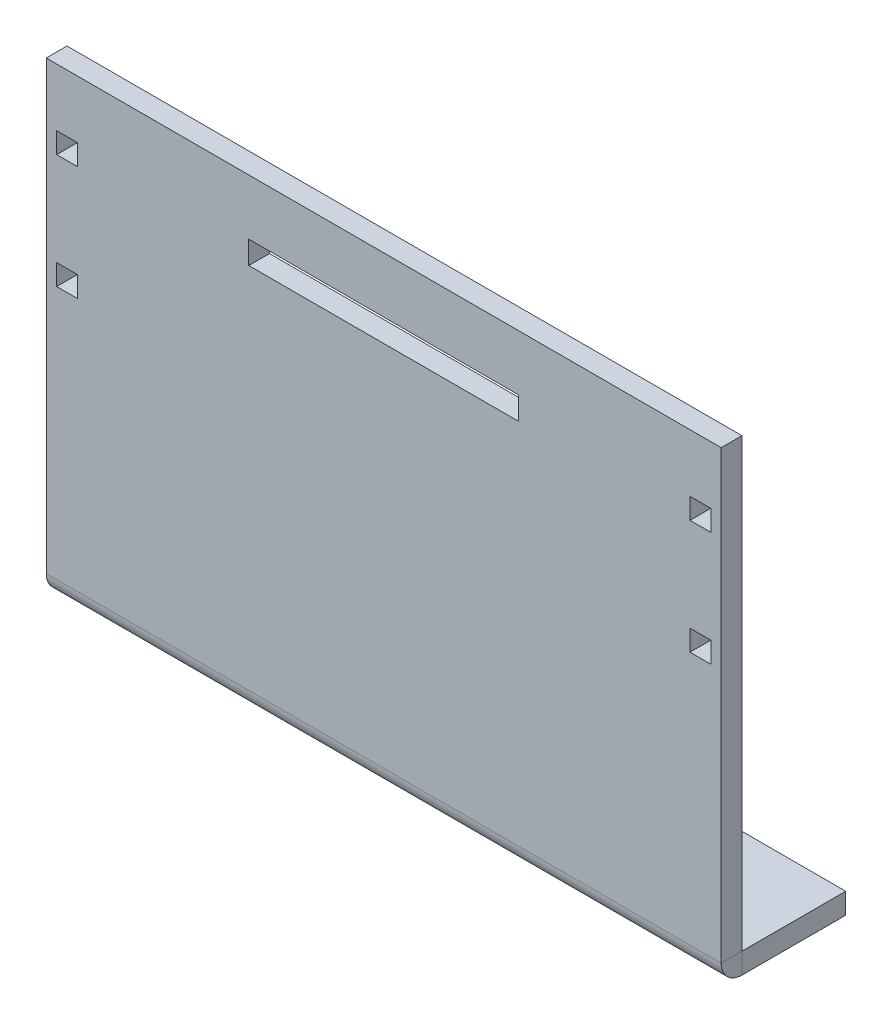
ISO-10303-21;
HEADER;
FILE_DESCRIPTION(('STEP AP214'),'2;1');
FILE_NAME('part.step','',(''),(''),'','','');
FILE_SCHEMA(('AUTOMOTIVE_DESIGN { 1 0 10303 214 1 1 1 1 }'));
ENDSEC;
DATA;
#1=APPLICATION_CONTEXT('core data for automotive mechanical design processes');
#2=APPLICATION_PROTOCOL_DEFINITION('international standard','automotive_design',2000,#1);
#3=PRODUCT_CONTEXT('',#1,'mechanical');
#4=PRODUCT('Part','Part','',(#3));
#5=PRODUCT_RELATED_PRODUCT_CATEGORY('part','',(#4));
#6=PRODUCT_DEFINITION_FORMATION('','',#4);
#7=PRODUCT_DEFINITION_CONTEXT('part definition',#1,'design');
#8=PRODUCT_DEFINITION('design','',#6,#7);
#9=PRODUCT_DEFINITION_SHAPE('','',#8);
#10=(LENGTH_UNIT() NAMED_UNIT(*) SI_UNIT(.MILLI.,.METRE.));
#11=(NAMED_UNIT(*) PLANE_ANGLE_UNIT() SI_UNIT($,.RADIAN.));
#12=(NAMED_UNIT(*) SI_UNIT($,.STERADIAN.) SOLID_ANGLE_UNIT());
#13=UNCERTAINTY_MEASURE_WITH_UNIT(LENGTH_MEASURE(1.E-05),#10,'distance_accuracy_value','');
#14=(GEOMETRIC_REPRESENTATION_CONTEXT(3) GLOBAL_UNCERTAINTY_ASSIGNED_CONTEXT((#13)) GLOBAL_UNIT_ASSIGNED_CONTEXT((#10,
#11,#12)) REPRESENTATION_CONTEXT('',''));
#15=CARTESIAN_POINT('',(0.,0.,0.));
#16=DIRECTION('',(0.,0.,1.));
#17=DIRECTION('',(1.,0.,0.));
#18=AXIS2_PLACEMENT_3D('',#15,#16,#17);
#19=CARTESIAN_POINT('',(0.,-26.4390270962824,0.));
#20=DIRECTION('',(0.,1.,0.));
#21=DIRECTION('',(0.,0.,1.));
#22=AXIS2_PLACEMENT_3D('',#19,#20,#21);
#23=PLANE('',#22);
#24=DIRECTION('',(0.,0.,-1.));
#25=VECTOR('',#24,1.);
#26=CARTESIAN_POINT('',(-32.4252873563218,-26.4390270962824,0.));
#27=LINE('',#26,#25);
#28=CARTESIAN_POINT('',(-32.4252873563218,-26.4390270962825,-1.99999999999999));
#29=VERTEX_POINT('',#28);
#30=CARTESIAN_POINT('',(-32.4252873563218,-26.4390270962825,-12.));
#31=VERTEX_POINT('',#30);
#32=EDGE_CURVE('E494',#29,#31,#27,.T.);
#33=ORIENTED_EDGE('',*,*,#32,.T.);
#34=DIRECTION('',(1.,0.,0.));
#35=VECTOR('',#34,1.);
#36=CARTESIAN_POINT('',(0.,-26.4390270962825,-12.));
#37=LINE('',#36,#35);
#38=CARTESIAN_POINT('',(32.5747126436782,-26.4390270962825,-12.));
#39=VERTEX_POINT('',#38);
#40=EDGE_CURVE('E491',#31,#39,#37,.T.);
#41=ORIENTED_EDGE('',*,*,#40,.T.);
#42=DIRECTION('',(0.,0.,1.));
#43=VECTOR('',#42,1.);
#44=CARTESIAN_POINT('',(32.5747126436782,-26.4390270962824,0.));
#45=LINE('',#44,#43);
#46=CARTESIAN_POINT('',(32.5747126436782,-26.4390270962825,-1.99999999999999));
#47=VERTEX_POINT('',#46);
#48=EDGE_CURVE('E487',#39,#47,#45,.T.);
#49=ORIENTED_EDGE('',*,*,#48,.T.);
#50=DIRECTION('',(-1.,0.,0.));
#51=VECTOR('',#50,1.);
#52=CARTESIAN_POINT('',(0.,-26.4390270962825,-1.99999999999999));
#53=LINE('',#52,#51);
#54=EDGE_CURVE('E483',#47,#29,#53,.T.);
#55=ORIENTED_EDGE('',*,*,#54,.T.);
#56=EDGE_LOOP('',(#33,#41,#49,#55));
#57=FACE_BOUND('',#56,.T.);
#58=CARTESIAN_POINT('',(23.0747126436782,-26.4390270962825,-7.));
#59=DIRECTION('',(0.,-1.,0.));
#60=DIRECTION('',(0.,0.,-1.));
#61=AXIS2_PLACEMENT_3D('',#58,#59,#60);
#62=CIRCLE('',#61,1.65);
#63=CARTESIAN_POINT('',(23.0747126436782,-26.4390270962825,-8.65));
#64=VERTEX_POINT('',#63);
#65=EDGE_CURVE('E707',#64,#64,#62,.T.);
#66=ORIENTED_EDGE('',*,*,#65,.F.);
#67=EDGE_LOOP('',(#66));
#68=FACE_BOUND('',#67,.T.);
#69=CARTESIAN_POINT('',(-22.9252873563218,-26.4390270962825,-7.));
#70=DIRECTION('',(0.,1.,0.));
#71=DIRECTION('',(0.,0.,1.));
#72=AXIS2_PLACEMENT_3D('',#69,#70,#71);
#73=CIRCLE('',#72,1.65);
#74=CARTESIAN_POINT('',(-22.9252873563218,-26.4390270962825,-5.35));
#75=VERTEX_POINT('',#74);
#76=EDGE_CURVE('E306',#75,#75,#73,.T.);
#77=ORIENTED_EDGE('',*,*,#76,.T.);
#78=EDGE_LOOP('',(#77));
#79=FACE_BOUND('',#78,.T.);
#80=ADVANCED_FACE('F67',(#57,#68,#79),#23,.F.);
#81=CARTESIAN_POINT('',(0.,-24.4390270962824,0.));
#82=DIRECTION('',(0.,1.,0.));
#83=DIRECTION('',(0.,0.,1.));
#84=AXIS2_PLACEMENT_3D('',#81,#82,#83);
#85=PLANE('',#84);
#86=CARTESIAN_POINT('',(23.0747126436782,-24.4390270962825,-7.));
#87=DIRECTION('',(0.,-1.,0.));
#88=DIRECTION('',(0.,0.,-1.));
#89=AXIS2_PLACEMENT_3D('',#86,#87,#88);
#90=CIRCLE('',#89,1.65);
#91=CARTESIAN_POINT('',(23.0747126436782,-24.4390270962825,-8.65));
#92=VERTEX_POINT('',#91);
#93=EDGE_CURVE('E701',#92,#92,#90,.T.);
#94=ORIENTED_EDGE('',*,*,#93,.T.);
#95=EDGE_LOOP('',(#94));
#96=FACE_BOUND('',#95,.T.);
#97=DIRECTION('',(0.,0.,1.));
#98=VECTOR('',#97,1.);
#99=CARTESIAN_POINT('',(-32.4252873563218,-24.4390270962825,-12.));
#100=LINE('',#99,#98);
#101=CARTESIAN_POINT('',(-32.4252873563218,-24.4390270962824,-2.));
#102=VERTEX_POINT('',#101);
#103=CARTESIAN_POINT('',(-32.4252873563218,-24.4390270962825,-12.));
#104=VERTEX_POINT('',#103);
#105=EDGE_CURVE('E456',#102,#104,#100,.F.);
#106=ORIENTED_EDGE('',*,*,#105,.F.);
#107=DIRECTION('',(1.,0.,0.));
#108=VECTOR('',#107,1.);
#109=CARTESIAN_POINT('',(-32.4252873563218,-24.4390270962824,-2.));
#110=LINE('',#109,#108);
#111=CARTESIAN_POINT('',(32.5747126436782,-24.4390270962825,-2.));
#112=VERTEX_POINT('',#111);
#113=EDGE_CURVE('E498',#112,#102,#110,.F.);
#114=ORIENTED_EDGE('',*,*,#113,.F.);
#115=DIRECTION('',(0.,0.,-1.));
#116=VECTOR('',#115,1.);
#117=CARTESIAN_POINT('',(32.5747126436782,-24.4390270962824,-2.));
#118=LINE('',#117,#116);
#119=CARTESIAN_POINT('',(32.5747126436782,-24.4390270962825,-12.));
#120=VERTEX_POINT('',#119);
#121=EDGE_CURVE('E502',#120,#112,#118,.F.);
#122=ORIENTED_EDGE('',*,*,#121,.F.);
#123=DIRECTION('',(-1.,0.,0.));
#124=VECTOR('',#123,1.);
#125=CARTESIAN_POINT('',(32.5747126436782,-24.4390270962825,-12.));
#126=LINE('',#125,#124);
#127=EDGE_CURVE('E506',#104,#120,#126,.F.);
#128=ORIENTED_EDGE('',*,*,#127,.F.);
#129=EDGE_LOOP('',(#106,#114,#122,#128));
#130=FACE_BOUND('',#129,.T.);
#131=CARTESIAN_POINT('',(-22.9252873563218,-24.4390270962825,-7.));
#132=DIRECTION('',(0.,1.,0.));
#133=DIRECTION('',(0.,0.,1.));
#134=AXIS2_PLACEMENT_3D('',#131,#132,#133);
#135=CIRCLE('',#134,1.65);
#136=CARTESIAN_POINT('',(-22.9252873563218,-24.4390270962825,-5.35000000000001));
#137=VERTEX_POINT('',#136);
#138=EDGE_CURVE('E699',#137,#137,#135,.T.);
#139=ORIENTED_EDGE('',*,*,#138,.F.);
#140=EDGE_LOOP('',(#139));
#141=FACE_BOUND('',#140,.T.);
#142=ADVANCED_FACE('F586',(#96,#130,#141),#85,.T.);
#143=CARTESIAN_POINT('',(0.,0.,-2.));
#144=DIRECTION('',(0.,0.,1.));
#145=DIRECTION('',(1.,0.,0.));
#146=AXIS2_PLACEMENT_3D('',#143,#144,#145);
#147=PLANE('',#146);
#148=DIRECTION('',(1.,0.,0.));
#149=VECTOR('',#148,1.);
#150=CARTESIAN_POINT('',(-12.9252873563218,13.2,-2.));
#151=LINE('',#150,#149);
#152=CARTESIAN_POINT('',(-12.9252873563218,13.2,-2.));
#153=VERTEX_POINT('',#152);
#154=CARTESIAN_POINT('',(13.0747126436782,13.2,-2.));
#155=VERTEX_POINT('',#154);
#156=EDGE_CURVE('E349',#153,#155,#151,.T.);
#157=ORIENTED_EDGE('',*,*,#156,.F.);
#158=DIRECTION('',(0.,-1.,0.));
#159=VECTOR('',#158,1.);
#160=CARTESIAN_POINT('',(-12.9252873563218,13.2,-2.));
#161=LINE('',#160,#159);
#162=CARTESIAN_POINT('',(-12.9252873563218,11.,-2.));
#163=VERTEX_POINT('',#162);
#164=EDGE_CURVE('E364',#153,#163,#161,.T.);
#165=ORIENTED_EDGE('',*,*,#164,.T.);
#166=DIRECTION('',(1.,0.,0.));
#167=VECTOR('',#166,1.);
#168=CARTESIAN_POINT('',(-12.9252873563218,11.,-2.));
#169=LINE('',#168,#167);
#170=CARTESIAN_POINT('',(13.0747126436782,11.,-2.));
#171=VERTEX_POINT('',#170);
#172=EDGE_CURVE('E380',#163,#171,#169,.T.);
#173=ORIENTED_EDGE('',*,*,#172,.T.);
#174=DIRECTION('',(0.,-1.,0.));
#175=VECTOR('',#174,1.);
#176=CARTESIAN_POINT('',(13.0747126436782,13.2,-2.));
#177=LINE('',#176,#175);
#178=EDGE_CURVE('E377',#155,#171,#177,.T.);
#179=ORIENTED_EDGE('',*,*,#178,.F.);
#180=EDGE_LOOP('',(#157,#165,#173,#179));
#181=FACE_BOUND('',#180,.T.);
#182=DIRECTION('',(0.,1.,0.));
#183=VECTOR('',#182,1.);
#184=CARTESIAN_POINT('',(29.5747126436783,0.,-2.));
#185=LINE('',#184,#183);
#186=CARTESIAN_POINT('',(29.5747126436783,0.,-2.));
#187=VERTEX_POINT('',#186);
#188=CARTESIAN_POINT('',(29.5747126436783,1.99999999999999,-2.));
#189=VERTEX_POINT('',#188);
#190=EDGE_CURVE('E322',#187,#189,#185,.T.);
#191=ORIENTED_EDGE('',*,*,#190,.F.);
#192=DIRECTION('',(1.,0.,0.));
#193=VECTOR('',#192,1.);
#194=CARTESIAN_POINT('',(29.5747126436783,0.,-2.));
#195=LINE('',#194,#193);
#196=CARTESIAN_POINT('',(31.5747126436783,0.,-2.));
#197=VERTEX_POINT('',#196);
#198=EDGE_CURVE('E316',#187,#197,#195,.T.);
#199=ORIENTED_EDGE('',*,*,#198,.T.);
#200=DIRECTION('',(0.,1.,0.));
#201=VECTOR('',#200,1.);
#202=CARTESIAN_POINT('',(31.5747126436783,0.,-2.));
#203=LINE('',#202,#201);
#204=CARTESIAN_POINT('',(31.5747126436783,1.99999999999999,-2.));
#205=VERTEX_POINT('',#204);
#206=EDGE_CURVE('E336',#197,#205,#203,.T.);
#207=ORIENTED_EDGE('',*,*,#206,.T.);
#208=DIRECTION('',(1.,0.,0.));
#209=VECTOR('',#208,1.);
#210=CARTESIAN_POINT('',(29.5747126436783,1.99999999999999,-2.));
#211=LINE('',#210,#209);
#212=EDGE_CURVE('E340',#189,#205,#211,.T.);
#213=ORIENTED_EDGE('',*,*,#212,.F.);
#214=EDGE_LOOP('',(#191,#199,#207,#213));
#215=FACE_BOUND('',#214,.T.);
#216=DIRECTION('',(-1.,0.,0.));
#217=VECTOR('',#216,1.);
#218=CARTESIAN_POINT('',(0.,0.,-2.));
#219=LINE('',#218,#217);
#220=CARTESIAN_POINT('',(-29.4252873563217,0.,-2.));
#221=VERTEX_POINT('',#220);
#222=CARTESIAN_POINT('',(-31.4252873563217,0.,-2.));
#223=VERTEX_POINT('',#222);
#224=EDGE_CURVE('E436',#221,#223,#219,.T.);
#225=ORIENTED_EDGE('',*,*,#224,.F.);
#226=DIRECTION('',(0.,1.,0.));
#227=VECTOR('',#226,1.);
#228=CARTESIAN_POINT('',(-29.4252873563217,0.,-2.));
#229=LINE('',#228,#227);
#230=CARTESIAN_POINT('',(-29.4252873563217,1.99999999999999,-2.));
#231=VERTEX_POINT('',#230);
#232=EDGE_CURVE('E423',#221,#231,#229,.T.);
#233=ORIENTED_EDGE('',*,*,#232,.T.);
#234=DIRECTION('',(-1.,0.,0.));
#235=VECTOR('',#234,1.);
#236=CARTESIAN_POINT('',(0.,1.99999999999999,-2.));
#237=LINE('',#236,#235);
#238=CARTESIAN_POINT('',(-31.4252873563217,1.99999999999999,-2.));
#239=VERTEX_POINT('',#238);
#240=EDGE_CURVE('E427',#231,#239,#237,.T.);
#241=ORIENTED_EDGE('',*,*,#240,.T.);
#242=DIRECTION('',(0.,1.,0.));
#243=VECTOR('',#242,1.);
#244=CARTESIAN_POINT('',(-31.4252873563217,0.,-2.));
#245=LINE('',#244,#243);
#246=EDGE_CURVE('E432',#223,#239,#245,.T.);
#247=ORIENTED_EDGE('',*,*,#246,.F.);
#248=EDGE_LOOP('',(#225,#233,#241,#247));
#249=FACE_BOUND('',#248,.T.);
#250=ORIENTED_EDGE('',*,*,#113,.T.);
#251=DIRECTION('',(0.,-1.,0.));
#252=VECTOR('',#251,1.);
#253=CARTESIAN_POINT('',(-32.4252873563218,18.5609729037175,-2.));
#254=LINE('',#253,#252);
#255=CARTESIAN_POINT('',(-32.4252873563218,18.5609729037175,-2.));
#256=VERTEX_POINT('',#255);
#257=EDGE_CURVE('E528',#256,#102,#254,.T.);
#258=ORIENTED_EDGE('',*,*,#257,.F.);
#259=DIRECTION('',(-1.,0.,0.));
#260=VECTOR('',#259,1.);
#261=CARTESIAN_POINT('',(-32.4252873563218,18.5609729037175,-2.));
#262=LINE('',#261,#260);
#263=CARTESIAN_POINT('',(32.5747126436782,18.5609729037175,-2.));
#264=VERTEX_POINT('',#263);
#265=EDGE_CURVE('E536',#264,#256,#262,.T.);
#266=ORIENTED_EDGE('',*,*,#265,.F.);
#267=DIRECTION('',(0.,1.,0.));
#268=VECTOR('',#267,1.);
#269=CARTESIAN_POINT('',(32.5747126436782,18.5609729037175,-2.));
#270=LINE('',#269,#268);
#271=EDGE_CURVE('E532',#112,#264,#270,.T.);
#272=ORIENTED_EDGE('',*,*,#271,.F.);
#273=EDGE_LOOP('',(#250,#258,#266,#272));
#274=FACE_BOUND('',#273,.T.);
#275=DIRECTION('',(-1.,0.,0.));
#276=VECTOR('',#275,1.);
#277=CARTESIAN_POINT('',(-29.4252873563218,11.,-2.));
#278=LINE('',#277,#276);
#279=CARTESIAN_POINT('',(-29.4252873563218,11.,-2.));
#280=VERTEX_POINT('',#279);
#281=CARTESIAN_POINT('',(-31.4252873563218,11.,-2.));
#282=VERTEX_POINT('',#281);
#283=EDGE_CURVE('E287',#280,#282,#278,.T.);
#284=ORIENTED_EDGE('',*,*,#283,.F.);
#285=DIRECTION('',(0.,1.,0.));
#286=VECTOR('',#285,1.);
#287=CARTESIAN_POINT('',(-29.4252873563218,11.,-2.));
#288=LINE('',#287,#286);
#289=CARTESIAN_POINT('',(-29.4252873563218,13.,-2.));
#290=VERTEX_POINT('',#289);
#291=EDGE_CURVE('E254',#280,#290,#288,.T.);
#292=ORIENTED_EDGE('',*,*,#291,.T.);
#293=DIRECTION('',(-1.,0.,0.));
#294=VECTOR('',#293,1.);
#295=CARTESIAN_POINT('',(-29.4252873563218,13.,-2.));
#296=LINE('',#295,#294);
#297=CARTESIAN_POINT('',(-31.4252873563218,13.,-2.));
#298=VERTEX_POINT('',#297);
#299=EDGE_CURVE('E295',#290,#298,#296,.T.);
#300=ORIENTED_EDGE('',*,*,#299,.T.);
#301=DIRECTION('',(0.,1.,0.));
#302=VECTOR('',#301,1.);
#303=CARTESIAN_POINT('',(-31.4252873563218,11.,-2.));
#304=LINE('',#303,#302);
#305=EDGE_CURVE('E290',#282,#298,#304,.T.);
#306=ORIENTED_EDGE('',*,*,#305,.F.);
#307=EDGE_LOOP('',(#284,#292,#300,#306));
#308=FACE_BOUND('',#307,.T.);
#309=DIRECTION('',(0.,1.,0.));
#310=VECTOR('',#309,1.);
#311=CARTESIAN_POINT('',(29.5747126436782,11.,-2.));
#312=LINE('',#311,#310);
#313=CARTESIAN_POINT('',(29.5747126436782,11.,-2.));
#314=VERTEX_POINT('',#313);
#315=CARTESIAN_POINT('',(29.5747126436782,13.,-2.));
#316=VERTEX_POINT('',#315);
#317=EDGE_CURVE('E402',#314,#316,#312,.T.);
#318=ORIENTED_EDGE('',*,*,#317,.F.);
#319=DIRECTION('',(1.,0.,0.));
#320=VECTOR('',#319,1.);
#321=CARTESIAN_POINT('',(29.5747126436782,11.,-2.));
#322=LINE('',#321,#320);
#323=CARTESIAN_POINT('',(31.5747126436782,11.,-2.));
#324=VERTEX_POINT('',#323);
#325=EDGE_CURVE('E396',#314,#324,#322,.T.);
#326=ORIENTED_EDGE('',*,*,#325,.T.);
#327=DIRECTION('',(0.,1.,0.));
#328=VECTOR('',#327,1.);
#329=CARTESIAN_POINT('',(31.5747126436782,11.,-2.));
#330=LINE('',#329,#328);
#331=CARTESIAN_POINT('',(31.5747126436782,13.,-2.));
#332=VERTEX_POINT('',#331);
#333=EDGE_CURVE('E91',#324,#332,#330,.T.);
#334=ORIENTED_EDGE('',*,*,#333,.T.);
#335=DIRECTION('',(1.,0.,0.));
#336=VECTOR('',#335,1.);
#337=CARTESIAN_POINT('',(29.5747126436782,13.,-2.));
#338=LINE('',#337,#336);
#339=EDGE_CURVE('E418',#316,#332,#338,.T.);
#340=ORIENTED_EDGE('',*,*,#339,.F.);
#341=EDGE_LOOP('',(#318,#326,#334,#340));
#342=FACE_BOUND('',#341,.T.);
#343=ADVANCED_FACE('F576',(#181,#215,#249,#274,#308,#342),#147,.F.);
#344=CARTESIAN_POINT('',(0.,0.,0.));
#345=DIRECTION('',(0.,0.,1.));
#346=DIRECTION('',(1.,0.,0.));
#347=AXIS2_PLACEMENT_3D('',#344,#345,#346);
#348=PLANE('',#347);
#349=DIRECTION('',(0.,-1.,0.));
#350=VECTOR('',#349,1.);
#351=CARTESIAN_POINT('',(-12.9252873563218,13.2,0.));
#352=LINE('',#351,#350);
#353=CARTESIAN_POINT('',(-12.9252873563218,13.2,0.));
#354=VERTEX_POINT('',#353);
#355=CARTESIAN_POINT('',(-12.9252873563218,11.,0.));
#356=VERTEX_POINT('',#355);
#357=EDGE_CURVE('E371',#354,#356,#352,.T.);
#358=ORIENTED_EDGE('',*,*,#357,.F.);
#359=DIRECTION('',(1.,0.,0.));
#360=VECTOR('',#359,1.);
#361=CARTESIAN_POINT('',(-12.9252873563218,13.2,0.));
#362=LINE('',#361,#360);
#363=CARTESIAN_POINT('',(13.0747126436782,13.2,0.));
#364=VERTEX_POINT('',#363);
#365=EDGE_CURVE('E359',#354,#364,#362,.T.);
#366=ORIENTED_EDGE('',*,*,#365,.T.);
#367=DIRECTION('',(0.,-1.,0.));
#368=VECTOR('',#367,1.);
#369=CARTESIAN_POINT('',(13.0747126436782,13.2,0.));
#370=LINE('',#369,#368);
#371=CARTESIAN_POINT('',(13.0747126436782,11.,0.));
#372=VERTEX_POINT('',#371);
#373=EDGE_CURVE('E363',#364,#372,#370,.T.);
#374=ORIENTED_EDGE('',*,*,#373,.T.);
#375=DIRECTION('',(1.,0.,0.));
#376=VECTOR('',#375,1.);
#377=CARTESIAN_POINT('',(-12.9252873563218,11.,0.));
#378=LINE('',#377,#376);
#379=EDGE_CURVE('E368',#356,#372,#378,.T.);
#380=ORIENTED_EDGE('',*,*,#379,.F.);
#381=EDGE_LOOP('',(#358,#366,#374,#380));
#382=FACE_BOUND('',#381,.T.);
#383=DIRECTION('',(0.,1.,0.));
#384=VECTOR('',#383,1.);
#385=CARTESIAN_POINT('',(-29.4252873563218,11.,0.));
#386=LINE('',#385,#384);
#387=CARTESIAN_POINT('',(-29.4252873563218,11.,0.));
#388=VERTEX_POINT('',#387);
#389=CARTESIAN_POINT('',(-29.4252873563218,13.,0.));
#390=VERTEX_POINT('',#389);
#391=EDGE_CURVE('E251',#388,#390,#386,.T.);
#392=ORIENTED_EDGE('',*,*,#391,.F.);
#393=DIRECTION('',(-1.,0.,0.));
#394=VECTOR('',#393,1.);
#395=CARTESIAN_POINT('',(-29.4252873563218,11.,0.));
#396=LINE('',#395,#394);
#397=CARTESIAN_POINT('',(-31.4252873563218,11.,0.));
#398=VERTEX_POINT('',#397);
#399=EDGE_CURVE('E262',#388,#398,#396,.T.);
#400=ORIENTED_EDGE('',*,*,#399,.T.);
#401=DIRECTION('',(0.,1.,0.));
#402=VECTOR('',#401,1.);
#403=CARTESIAN_POINT('',(-31.4252873563218,11.,0.));
#404=LINE('',#403,#402);
#405=CARTESIAN_POINT('',(-31.4252873563218,13.,0.));
#406=VERTEX_POINT('',#405);
#407=EDGE_CURVE('E269',#398,#406,#404,.T.);
#408=ORIENTED_EDGE('',*,*,#407,.T.);
#409=DIRECTION('',(-1.,0.,0.));
#410=VECTOR('',#409,1.);
#411=CARTESIAN_POINT('',(-29.4252873563218,13.,0.));
#412=LINE('',#411,#410);
#413=EDGE_CURVE('E275',#390,#406,#412,.T.);
#414=ORIENTED_EDGE('',*,*,#413,.F.);
#415=EDGE_LOOP('',(#392,#400,#408,#414));
#416=FACE_BOUND('',#415,.T.);
#417=DIRECTION('',(0.,1.,0.));
#418=VECTOR('',#417,1.);
#419=CARTESIAN_POINT('',(-29.4252873563217,0.,0.));
#420=LINE('',#419,#418);
#421=CARTESIAN_POINT('',(-29.4252873563217,0.,0.));
#422=VERTEX_POINT('',#421);
#423=CARTESIAN_POINT('',(-29.4252873563217,1.99999999999999,0.));
#424=VERTEX_POINT('',#423);
#425=EDGE_CURVE('E374',#422,#424,#420,.T.);
#426=ORIENTED_EDGE('',*,*,#425,.F.);
#427=DIRECTION('',(-1.,0.,0.));
#428=VECTOR('',#427,1.);
#429=CARTESIAN_POINT('',(0.,0.,0.));
#430=LINE('',#429,#428);
#431=CARTESIAN_POINT('',(-31.4252873563217,0.,0.));
#432=VERTEX_POINT('',#431);
#433=EDGE_CURVE('E428',#422,#432,#430,.T.);
#434=ORIENTED_EDGE('',*,*,#433,.T.);
#435=DIRECTION('',(0.,1.,0.));
#436=VECTOR('',#435,1.);
#437=CARTESIAN_POINT('',(-31.4252873563217,0.,0.));
#438=LINE('',#437,#436);
#439=CARTESIAN_POINT('',(-31.4252873563217,1.99999999999999,0.));
#440=VERTEX_POINT('',#439);
#441=EDGE_CURVE('E446',#432,#440,#438,.T.);
#442=ORIENTED_EDGE('',*,*,#441,.T.);
#443=DIRECTION('',(-1.,0.,0.));
#444=VECTOR('',#443,1.);
#445=CARTESIAN_POINT('',(0.,1.99999999999999,0.));
#446=LINE('',#445,#444);
#447=EDGE_CURVE('E442',#424,#440,#446,.T.);
#448=ORIENTED_EDGE('',*,*,#447,.F.);
#449=EDGE_LOOP('',(#426,#434,#442,#448));
#450=FACE_BOUND('',#449,.T.);
#451=DIRECTION('',(0.,-1.,0.));
#452=VECTOR('',#451,1.);
#453=CARTESIAN_POINT('',(-32.4252873563218,18.5609729037175,0.));
#454=LINE('',#453,#452);
#455=CARTESIAN_POINT('',(-32.4252873563218,18.5609729037175,0.));
#456=VERTEX_POINT('',#455);
#457=CARTESIAN_POINT('',(-32.4252873563218,-24.4390270962825,0.));
#458=VERTEX_POINT('',#457);
#459=EDGE_CURVE('E527',#456,#458,#454,.T.);
#460=ORIENTED_EDGE('',*,*,#459,.T.);
#461=DIRECTION('',(-1.,0.,0.));
#462=VECTOR('',#461,1.);
#463=CARTESIAN_POINT('',(0.,-24.4390270962824,0.));
#464=LINE('',#463,#462);
#465=CARTESIAN_POINT('',(32.5747126436782,-24.4390270962824,0.));
#466=VERTEX_POINT('',#465);
#467=EDGE_CURVE('E514',#466,#458,#464,.T.);
#468=ORIENTED_EDGE('',*,*,#467,.F.);
#469=DIRECTION('',(0.,1.,0.));
#470=VECTOR('',#469,1.);
#471=CARTESIAN_POINT('',(32.5747126436782,18.5609729037175,0.));
#472=LINE('',#471,#470);
#473=CARTESIAN_POINT('',(32.5747126436782,18.5609729037175,0.));
#474=VERTEX_POINT('',#473);
#475=EDGE_CURVE('E543',#466,#474,#472,.T.);
#476=ORIENTED_EDGE('',*,*,#475,.T.);
#477=DIRECTION('',(-1.,0.,0.));
#478=VECTOR('',#477,1.);
#479=CARTESIAN_POINT('',(-32.4252873563218,18.5609729037175,0.));
#480=LINE('',#479,#478);
#481=EDGE_CURVE('E533',#474,#456,#480,.T.);
#482=ORIENTED_EDGE('',*,*,#481,.T.);
#483=EDGE_LOOP('',(#460,#468,#476,#482));
#484=FACE_BOUND('',#483,.T.);
#485=DIRECTION('',(1.,0.,0.));
#486=VECTOR('',#485,1.);
#487=CARTESIAN_POINT('',(29.5747126436783,0.,0.));
#488=LINE('',#487,#486);
#489=CARTESIAN_POINT('',(29.5747126436783,0.,0.));
#490=VERTEX_POINT('',#489);
#491=CARTESIAN_POINT('',(31.5747126436783,0.,0.));
#492=VERTEX_POINT('',#491);
#493=EDGE_CURVE('E317',#490,#492,#488,.T.);
#494=ORIENTED_EDGE('',*,*,#493,.F.);
#495=DIRECTION('',(0.,1.,0.));
#496=VECTOR('',#495,1.);
#497=CARTESIAN_POINT('',(29.5747126436783,0.,0.));
#498=LINE('',#497,#496);
#499=CARTESIAN_POINT('',(29.5747126436783,1.99999999999999,0.));
#500=VERTEX_POINT('',#499);
#501=EDGE_CURVE('E259',#490,#500,#498,.T.);
#502=ORIENTED_EDGE('',*,*,#501,.T.);
#503=DIRECTION('',(1.,0.,0.));
#504=VECTOR('',#503,1.);
#505=CARTESIAN_POINT('',(29.5747126436783,1.99999999999999,0.));
#506=LINE('',#505,#504);
#507=CARTESIAN_POINT('',(31.5747126436783,1.99999999999999,0.));
#508=VERTEX_POINT('',#507);
#509=EDGE_CURVE('E326',#500,#508,#506,.T.);
#510=ORIENTED_EDGE('',*,*,#509,.T.);
#511=DIRECTION('',(0.,1.,0.));
#512=VECTOR('',#511,1.);
#513=CARTESIAN_POINT('',(31.5747126436783,0.,0.));
#514=LINE('',#513,#512);
#515=EDGE_CURVE('E321',#492,#508,#514,.T.);
#516=ORIENTED_EDGE('',*,*,#515,.F.);
#517=EDGE_LOOP('',(#494,#502,#510,#516));
#518=FACE_BOUND('',#517,.T.);
#519=DIRECTION('',(1.,0.,0.));
#520=VECTOR('',#519,1.);
#521=CARTESIAN_POINT('',(29.5747126436782,11.,0.));
#522=LINE('',#521,#520);
#523=CARTESIAN_POINT('',(29.5747126436782,11.,0.));
#524=VERTEX_POINT('',#523);
#525=CARTESIAN_POINT('',(31.5747126436782,11.,0.));
#526=VERTEX_POINT('',#525);
#527=EDGE_CURVE('E397',#524,#526,#522,.T.);
#528=ORIENTED_EDGE('',*,*,#527,.F.);
#529=DIRECTION('',(0.,1.,0.));
#530=VECTOR('',#529,1.);
#531=CARTESIAN_POINT('',(29.5747126436782,11.,0.));
#532=LINE('',#531,#530);
#533=CARTESIAN_POINT('',(29.5747126436782,13.,0.));
#534=VERTEX_POINT('',#533);
#535=EDGE_CURVE('E358',#524,#534,#532,.T.);
#536=ORIENTED_EDGE('',*,*,#535,.T.);
#537=DIRECTION('',(1.,0.,0.));
#538=VECTOR('',#537,1.);
#539=CARTESIAN_POINT('',(29.5747126436782,13.,0.));
#540=LINE('',#539,#538);
#541=CARTESIAN_POINT('',(31.5747126436782,13.,0.));
#542=VERTEX_POINT('',#541);
#543=EDGE_CURVE('E406',#534,#542,#540,.T.);
#544=ORIENTED_EDGE('',*,*,#543,.T.);
#545=DIRECTION('',(0.,1.,0.));
#546=VECTOR('',#545,1.);
#547=CARTESIAN_POINT('',(31.5747126436782,11.,0.));
#548=LINE('',#547,#546);
#549=EDGE_CURVE('E401',#526,#542,#548,.T.);
#550=ORIENTED_EDGE('',*,*,#549,.F.);
#551=EDGE_LOOP('',(#528,#536,#544,#550));
#552=FACE_BOUND('',#551,.T.);
#553=ADVANCED_FACE('F272',(#382,#416,#450,#484,#518,#552),#348,.T.);
#554=CARTESIAN_POINT('',(-32.4252873563218,18.5609729037175,-2.));
#555=DIRECTION('',(-1.,0.,0.));
#556=DIRECTION('',(0.,0.,1.));
#557=AXIS2_PLACEMENT_3D('',#554,#555,#556);
#558=PLANE('',#557);
#559=ORIENTED_EDGE('',*,*,#257,.T.);
#560=DIRECTION('',(0.,0.,-1.));
#561=VECTOR('',#560,1.);
#562=CARTESIAN_POINT('',(-32.4252873563218,-24.4390270962824,0.));
#563=LINE('',#562,#561);
#564=EDGE_CURVE('E470',#458,#102,#563,.T.);
#565=ORIENTED_EDGE('',*,*,#564,.F.);
#566=ORIENTED_EDGE('',*,*,#459,.F.);
#567=DIRECTION('',(0.,0.,1.));
#568=VECTOR('',#567,1.);
#569=CARTESIAN_POINT('',(-32.4252873563218,18.5609729037175,-2.));
#570=LINE('',#569,#568);
#571=EDGE_CURVE('E13',#256,#456,#570,.T.);
#572=ORIENTED_EDGE('',*,*,#571,.F.);
#573=EDGE_LOOP('',(#559,#565,#566,#572));
#574=FACE_BOUND('',#573,.T.);
#575=ADVANCED_FACE('F69',(#574),#558,.T.);
#576=CARTESIAN_POINT('',(-32.4252873563218,18.5609729037175,-2.));
#577=DIRECTION('',(0.,1.,0.));
#578=DIRECTION('',(0.,0.,1.));
#579=AXIS2_PLACEMENT_3D('',#576,#577,#578);
#580=PLANE('',#579);
#581=ORIENTED_EDGE('',*,*,#481,.F.);
#582=DIRECTION('',(0.,0.,1.));
#583=VECTOR('',#582,1.);
#584=CARTESIAN_POINT('',(32.5747126436782,18.5609729037175,-2.));
#585=LINE('',#584,#583);
#586=EDGE_CURVE('E71',#264,#474,#585,.T.);
#587=ORIENTED_EDGE('',*,*,#586,.F.);
#588=ORIENTED_EDGE('',*,*,#265,.T.);
#589=ORIENTED_EDGE('',*,*,#571,.T.);
#590=EDGE_LOOP('',(#581,#587,#588,#589));
#591=FACE_BOUND('',#590,.T.);
#592=ADVANCED_FACE('F557',(#591),#580,.T.);
#593=CARTESIAN_POINT('',(32.5747126436782,18.5609729037175,-2.));
#594=DIRECTION('',(1.,0.,0.));
#595=DIRECTION('',(0.,0.,-1.));
#596=AXIS2_PLACEMENT_3D('',#593,#594,#595);
#597=PLANE('',#596);
#598=DIRECTION('',(0.,0.,-1.));
#599=VECTOR('',#598,1.);
#600=CARTESIAN_POINT('',(32.5747126436782,-24.4390270962824,0.));
#601=LINE('',#600,#599);
#602=EDGE_CURVE('E518',#466,#112,#601,.T.);
#603=ORIENTED_EDGE('',*,*,#602,.T.);
#604=ORIENTED_EDGE('',*,*,#271,.T.);
#605=ORIENTED_EDGE('',*,*,#586,.T.);
#606=ORIENTED_EDGE('',*,*,#475,.F.);
#607=EDGE_LOOP('',(#603,#604,#605,#606));
#608=FACE_BOUND('',#607,.T.);
#609=ADVANCED_FACE('F574',(#608),#597,.T.);
#610=CARTESIAN_POINT('',(-32.4252873563218,-24.4390270962824,0.));
#611=DIRECTION('',(-1.,0.,0.));
#612=DIRECTION('',(0.,0.,1.));
#613=AXIS2_PLACEMENT_3D('',#610,#611,#612);
#614=PLANE('',#613);
#615=CARTESIAN_POINT('',(-32.4252873563218,-24.4390270962824,-2.));
#616=DIRECTION('',(1.,0.,0.));
#617=DIRECTION('',(0.,0.,-1.));
#618=AXIS2_PLACEMENT_3D('',#615,#616,#617);
#619=CIRCLE('',#618,2.);
#620=EDGE_CURVE('E524',#458,#29,#619,.T.);
#621=ORIENTED_EDGE('',*,*,#620,.F.);
#622=ORIENTED_EDGE('',*,*,#564,.T.);
#623=DIRECTION('',(0.,1.,0.));
#624=VECTOR('',#623,1.);
#625=CARTESIAN_POINT('',(-32.4252873563218,-26.4390270962825,-1.99999999999999));
#626=LINE('',#625,#624);
#627=EDGE_CURVE('E479',#29,#102,#626,.T.);
#628=ORIENTED_EDGE('',*,*,#627,.F.);
#629=EDGE_LOOP('',(#621,#622,#628));
#630=FACE_BOUND('',#629,.T.);
#631=ADVANCED_FACE('F563',(#630),#614,.T.);
#632=CARTESIAN_POINT('',(32.5747126436782,-24.4390270962824,-2.));
#633=DIRECTION('',(1.,0.,0.));
#634=DIRECTION('',(0.,0.,-1.));
#635=AXIS2_PLACEMENT_3D('',#632,#633,#634);
#636=CYLINDRICAL_SURFACE('',#635,2.);
#637=CARTESIAN_POINT('',(32.5747126436782,-24.4390270962824,-2.));
#638=DIRECTION('',(1.,0.,0.));
#639=DIRECTION('',(0.,0.,-1.));
#640=AXIS2_PLACEMENT_3D('',#637,#638,#639);
#641=CIRCLE('',#640,2.);
#642=EDGE_CURVE('E521',#466,#47,#641,.T.);
#643=ORIENTED_EDGE('',*,*,#642,.F.);
#644=ORIENTED_EDGE('',*,*,#467,.T.);
#645=ORIENTED_EDGE('',*,*,#620,.T.);
#646=ORIENTED_EDGE('',*,*,#54,.F.);
#647=EDGE_LOOP('',(#643,#644,#645,#646));
#648=FACE_BOUND('',#647,.T.);
#649=ADVANCED_FACE('F567',(#648),#636,.T.);
#650=CARTESIAN_POINT('',(32.5747126436782,-24.4390270962824,0.));
#651=DIRECTION('',(-1.,0.,0.));
#652=DIRECTION('',(0.,0.,1.));
#653=AXIS2_PLACEMENT_3D('',#650,#651,#652);
#654=PLANE('',#653);
#655=ORIENTED_EDGE('',*,*,#602,.F.);
#656=ORIENTED_EDGE('',*,*,#642,.T.);
#657=DIRECTION('',(0.,1.,0.));
#658=VECTOR('',#657,1.);
#659=CARTESIAN_POINT('',(32.5747126436782,-26.4390270962825,-1.99999999999999));
#660=LINE('',#659,#658);
#661=EDGE_CURVE('E475',#47,#112,#660,.T.);
#662=ORIENTED_EDGE('',*,*,#661,.T.);
#663=EDGE_LOOP('',(#655,#656,#662));
#664=FACE_BOUND('',#663,.T.);
#665=ADVANCED_FACE('F570',(#664),#654,.F.);
#666=CARTESIAN_POINT('',(-32.4252873563218,-26.4390270962825,-12.));
#667=DIRECTION('',(1.,0.,0.));
#668=DIRECTION('',(0.,0.,-1.));
#669=AXIS2_PLACEMENT_3D('',#666,#667,#668);
#670=PLANE('',#669);
#671=ORIENTED_EDGE('',*,*,#105,.T.);
#672=DIRECTION('',(0.,1.,0.));
#673=VECTOR('',#672,1.);
#674=CARTESIAN_POINT('',(-32.4252873563218,-26.4390270962825,-12.));
#675=LINE('',#674,#673);
#676=EDGE_CURVE('E466',#31,#104,#675,.T.);
#677=ORIENTED_EDGE('',*,*,#676,.F.);
#678=ORIENTED_EDGE('',*,*,#32,.F.);
#679=ORIENTED_EDGE('',*,*,#627,.T.);
#680=EDGE_LOOP('',(#671,#677,#678,#679));
#681=FACE_BOUND('',#680,.T.);
#682=ADVANCED_FACE('F584',(#681),#670,.F.);
#683=CARTESIAN_POINT('',(32.5747126436782,-26.4390270962825,-12.));
#684=DIRECTION('',(0.,0.,1.));
#685=DIRECTION('',(0.,-1.,0.));
#686=AXIS2_PLACEMENT_3D('',#683,#684,#685);
#687=PLANE('',#686);
#688=ORIENTED_EDGE('',*,*,#127,.T.);
#689=DIRECTION('',(0.,1.,0.));
#690=VECTOR('',#689,1.);
#691=CARTESIAN_POINT('',(32.5747126436782,-26.4390270962825,-12.));
#692=LINE('',#691,#690);
#693=EDGE_CURVE('E471',#39,#120,#692,.T.);
#694=ORIENTED_EDGE('',*,*,#693,.F.);
#695=ORIENTED_EDGE('',*,*,#40,.F.);
#696=ORIENTED_EDGE('',*,*,#676,.T.);
#697=EDGE_LOOP('',(#688,#694,#695,#696));
#698=FACE_BOUND('',#697,.T.);
#699=ADVANCED_FACE('F590',(#698),#687,.F.);
#700=CARTESIAN_POINT('',(32.5747126436782,-26.4390270962825,-1.99999999999999));
#701=DIRECTION('',(-1.,0.,0.));
#702=DIRECTION('',(0.,0.,1.));
#703=AXIS2_PLACEMENT_3D('',#700,#701,#702);
#704=PLANE('',#703);
#705=ORIENTED_EDGE('',*,*,#121,.T.);
#706=ORIENTED_EDGE('',*,*,#661,.F.);
#707=ORIENTED_EDGE('',*,*,#48,.F.);
#708=ORIENTED_EDGE('',*,*,#693,.T.);
#709=EDGE_LOOP('',(#705,#706,#707,#708));
#710=FACE_BOUND('',#709,.T.);
#711=ADVANCED_FACE('F595',(#710),#704,.F.);
#712=CARTESIAN_POINT('',(-29.4252873563217,0.,-2.));
#713=DIRECTION('',(1.,0.,0.));
#714=DIRECTION('',(0.,0.,-1.));
#715=AXIS2_PLACEMENT_3D('',#712,#713,#714);
#716=PLANE('',#715);
#717=ORIENTED_EDGE('',*,*,#425,.T.);
#718=DIRECTION('',(0.,0.,1.));
#719=VECTOR('',#718,1.);
#720=CARTESIAN_POINT('',(-29.4252873563217,1.99999999999999,-2.));
#721=LINE('',#720,#719);
#722=EDGE_CURVE('E439',#231,#424,#721,.T.);
#723=ORIENTED_EDGE('',*,*,#722,.F.);
#724=ORIENTED_EDGE('',*,*,#232,.F.);
#725=DIRECTION('',(0.,0.,1.));
#726=VECTOR('',#725,1.);
#727=CARTESIAN_POINT('',(-29.4252873563217,0.,-2.));
#728=LINE('',#727,#726);
#729=EDGE_CURVE('E453',#221,#422,#728,.T.);
#730=ORIENTED_EDGE('',*,*,#729,.T.);
#731=EDGE_LOOP('',(#717,#723,#724,#730));
#732=FACE_BOUND('',#731,.T.);
#733=ADVANCED_FACE('F597',(#732),#716,.F.);
#734=CARTESIAN_POINT('',(0.,0.,-2.));
#735=DIRECTION('',(0.,1.,0.));
#736=DIRECTION('',(-1.,0.,0.));
#737=AXIS2_PLACEMENT_3D('',#734,#735,#736);
#738=PLANE('',#737);
#739=ORIENTED_EDGE('',*,*,#433,.F.);
#740=ORIENTED_EDGE('',*,*,#729,.F.);
#741=ORIENTED_EDGE('',*,*,#224,.T.);
#742=DIRECTION('',(0.,0.,1.));
#743=VECTOR('',#742,1.);
#744=CARTESIAN_POINT('',(-31.4252873563217,0.,-2.));
#745=LINE('',#744,#743);
#746=EDGE_CURVE('E457',#223,#432,#745,.T.);
#747=ORIENTED_EDGE('',*,*,#746,.T.);
#748=EDGE_LOOP('',(#739,#740,#741,#747));
#749=FACE_BOUND('',#748,.T.);
#750=ADVANCED_FACE('F604',(#749),#738,.T.);
#751=CARTESIAN_POINT('',(-31.4252873563217,0.,-2.));
#752=DIRECTION('',(1.,0.,0.));
#753=DIRECTION('',(0.,0.,-1.));
#754=AXIS2_PLACEMENT_3D('',#751,#752,#753);
#755=PLANE('',#754);
#756=ORIENTED_EDGE('',*,*,#441,.F.);
#757=ORIENTED_EDGE('',*,*,#746,.F.);
#758=ORIENTED_EDGE('',*,*,#246,.T.);
#759=DIRECTION('',(0.,0.,1.));
#760=VECTOR('',#759,1.);
#761=CARTESIAN_POINT('',(-31.4252873563217,1.99999999999999,-2.));
#762=LINE('',#761,#760);
#763=EDGE_CURVE('E460',#239,#440,#762,.T.);
#764=ORIENTED_EDGE('',*,*,#763,.T.);
#765=EDGE_LOOP('',(#756,#757,#758,#764));
#766=FACE_BOUND('',#765,.T.);
#767=ADVANCED_FACE('F621',(#766),#755,.T.);
#768=CARTESIAN_POINT('',(0.,1.99999999999999,-2.));
#769=DIRECTION('',(0.,1.,0.));
#770=DIRECTION('',(0.,0.,1.));
#771=AXIS2_PLACEMENT_3D('',#768,#769,#770);
#772=PLANE('',#771);
#773=ORIENTED_EDGE('',*,*,#447,.T.);
#774=ORIENTED_EDGE('',*,*,#763,.F.);
#775=ORIENTED_EDGE('',*,*,#240,.F.);
#776=ORIENTED_EDGE('',*,*,#722,.T.);
#777=EDGE_LOOP('',(#773,#774,#775,#776));
#778=FACE_BOUND('',#777,.T.);
#779=ADVANCED_FACE('F617',(#778),#772,.F.);
#780=CARTESIAN_POINT('',(29.5747126436783,0.,-2.));
#781=DIRECTION('',(1.,0.,0.));
#782=DIRECTION('',(0.,0.,-1.));
#783=AXIS2_PLACEMENT_3D('',#780,#781,#782);
#784=PLANE('',#783);
#785=ORIENTED_EDGE('',*,*,#501,.F.);
#786=DIRECTION('',(0.,0.,1.));
#787=VECTOR('',#786,1.);
#788=CARTESIAN_POINT('',(29.5747126436783,0.,-2.));
#789=LINE('',#788,#787);
#790=EDGE_CURVE('E312',#187,#490,#789,.T.);
#791=ORIENTED_EDGE('',*,*,#790,.F.);
#792=ORIENTED_EDGE('',*,*,#190,.T.);
#793=DIRECTION('',(0.,0.,1.));
#794=VECTOR('',#793,1.);
#795=CARTESIAN_POINT('',(29.5747126436783,1.99999999999999,-2.));
#796=LINE('',#795,#794);
#797=EDGE_CURVE('E301',#189,#500,#796,.T.);
#798=ORIENTED_EDGE('',*,*,#797,.T.);
#799=EDGE_LOOP('',(#785,#791,#792,#798));
#800=FACE_BOUND('',#799,.T.);
#801=ADVANCED_FACE('F620',(#800),#784,.T.);
#802=CARTESIAN_POINT('',(29.5747126436783,1.99999999999999,-2.));
#803=DIRECTION('',(0.,-1.,0.));
#804=DIRECTION('',(0.,0.,-1.));
#805=AXIS2_PLACEMENT_3D('',#802,#803,#804);
#806=PLANE('',#805);
#807=ORIENTED_EDGE('',*,*,#509,.F.);
#808=ORIENTED_EDGE('',*,*,#797,.F.);
#809=ORIENTED_EDGE('',*,*,#212,.T.);
#810=DIRECTION('',(0.,0.,1.));
#811=VECTOR('',#810,1.);
#812=CARTESIAN_POINT('',(31.5747126436783,1.99999999999999,-2.));
#813=LINE('',#812,#811);
#814=EDGE_CURVE('E305',#205,#508,#813,.T.);
#815=ORIENTED_EDGE('',*,*,#814,.T.);
#816=EDGE_LOOP('',(#807,#808,#809,#815));
#817=FACE_BOUND('',#816,.T.);
#818=ADVANCED_FACE('F667',(#817),#806,.T.);
#819=CARTESIAN_POINT('',(31.5747126436783,0.,-2.));
#820=DIRECTION('',(1.,0.,0.));
#821=DIRECTION('',(0.,0.,-1.));
#822=AXIS2_PLACEMENT_3D('',#819,#820,#821);
#823=PLANE('',#822);
#824=ORIENTED_EDGE('',*,*,#515,.T.);
#825=ORIENTED_EDGE('',*,*,#814,.F.);
#826=ORIENTED_EDGE('',*,*,#206,.F.);
#827=DIRECTION('',(0.,0.,1.));
#828=VECTOR('',#827,1.);
#829=CARTESIAN_POINT('',(31.5747126436783,0.,-2.));
#830=LINE('',#829,#828);
#831=EDGE_CURVE('E309',#197,#492,#830,.T.);
#832=ORIENTED_EDGE('',*,*,#831,.T.);
#833=EDGE_LOOP('',(#824,#825,#826,#832));
#834=FACE_BOUND('',#833,.T.);
#835=ADVANCED_FACE('F663',(#834),#823,.F.);
#836=CARTESIAN_POINT('',(29.5747126436783,0.,-2.));
#837=DIRECTION('',(0.,-1.,0.));
#838=DIRECTION('',(1.,0.,0.));
#839=AXIS2_PLACEMENT_3D('',#836,#837,#838);
#840=PLANE('',#839);
#841=ORIENTED_EDGE('',*,*,#493,.T.);
#842=ORIENTED_EDGE('',*,*,#831,.F.);
#843=ORIENTED_EDGE('',*,*,#198,.F.);
#844=ORIENTED_EDGE('',*,*,#790,.T.);
#845=EDGE_LOOP('',(#841,#842,#843,#844));
#846=FACE_BOUND('',#845,.T.);
#847=ADVANCED_FACE('F660',(#846),#840,.F.);
#848=CARTESIAN_POINT('',(-29.4252873563218,11.,-2.));
#849=DIRECTION('',(1.,0.,0.));
#850=DIRECTION('',(0.,0.,-1.));
#851=AXIS2_PLACEMENT_3D('',#848,#849,#850);
#852=PLANE('',#851);
#853=ORIENTED_EDGE('',*,*,#391,.T.);
#854=DIRECTION('',(0.,0.,1.));
#855=VECTOR('',#854,1.);
#856=CARTESIAN_POINT('',(-29.4252873563218,13.,-2.));
#857=LINE('',#856,#855);
#858=EDGE_CURVE('E291',#290,#390,#857,.T.);
#859=ORIENTED_EDGE('',*,*,#858,.F.);
#860=ORIENTED_EDGE('',*,*,#291,.F.);
#861=DIRECTION('',(0.,0.,1.));
#862=VECTOR('',#861,1.);
#863=CARTESIAN_POINT('',(-29.4252873563218,11.,-2.));
#864=LINE('',#863,#862);
#865=EDGE_CURVE('E247',#280,#388,#864,.T.);
#866=ORIENTED_EDGE('',*,*,#865,.T.);
#867=EDGE_LOOP('',(#853,#859,#860,#866));
#868=FACE_BOUND('',#867,.T.);
#869=ADVANCED_FACE('F249',(#868),#852,.F.);
#870=CARTESIAN_POINT('',(-29.4252873563218,11.,-2.));
#871=DIRECTION('',(0.,1.,0.));
#872=DIRECTION('',(-1.,0.,0.));
#873=AXIS2_PLACEMENT_3D('',#870,#871,#872);
#874=PLANE('',#873);
#875=ORIENTED_EDGE('',*,*,#399,.F.);
#876=ORIENTED_EDGE('',*,*,#865,.F.);
#877=ORIENTED_EDGE('',*,*,#283,.T.);
#878=DIRECTION('',(0.,0.,1.));
#879=VECTOR('',#878,1.);
#880=CARTESIAN_POINT('',(-31.4252873563218,11.,-2.));
#881=LINE('',#880,#879);
#882=EDGE_CURVE('E258',#282,#398,#881,.T.);
#883=ORIENTED_EDGE('',*,*,#882,.T.);
#884=EDGE_LOOP('',(#875,#876,#877,#883));
#885=FACE_BOUND('',#884,.T.);
#886=ADVANCED_FACE('F263',(#885),#874,.T.);
#887=CARTESIAN_POINT('',(-31.4252873563218,11.,-2.));
#888=DIRECTION('',(1.,0.,0.));
#889=DIRECTION('',(0.,0.,-1.));
#890=AXIS2_PLACEMENT_3D('',#887,#888,#889);
#891=PLANE('',#890);
#892=ORIENTED_EDGE('',*,*,#407,.F.);
#893=ORIENTED_EDGE('',*,*,#882,.F.);
#894=ORIENTED_EDGE('',*,*,#305,.T.);
#895=DIRECTION('',(0.,0.,1.));
#896=VECTOR('',#895,1.);
#897=CARTESIAN_POINT('',(-31.4252873563218,13.,-2.));
#898=LINE('',#897,#896);
#899=EDGE_CURVE('E715',#298,#406,#898,.T.);
#900=ORIENTED_EDGE('',*,*,#899,.T.);
#901=EDGE_LOOP('',(#892,#893,#894,#900));
#902=FACE_BOUND('',#901,.T.);
#903=ADVANCED_FACE('F677',(#902),#891,.T.);
#904=CARTESIAN_POINT('',(-29.4252873563218,13.,-2.));
#905=DIRECTION('',(0.,1.,0.));
#906=DIRECTION('',(0.,0.,1.));
#907=AXIS2_PLACEMENT_3D('',#904,#905,#906);
#908=PLANE('',#907);
#909=ORIENTED_EDGE('',*,*,#413,.T.);
#910=ORIENTED_EDGE('',*,*,#899,.F.);
#911=ORIENTED_EDGE('',*,*,#299,.F.);
#912=ORIENTED_EDGE('',*,*,#858,.T.);
#913=EDGE_LOOP('',(#909,#910,#911,#912));
#914=FACE_BOUND('',#913,.T.);
#915=ADVANCED_FACE('F644',(#914),#908,.F.);
#916=CARTESIAN_POINT('',(29.5747126436782,11.,-2.));
#917=DIRECTION('',(1.,0.,0.));
#918=DIRECTION('',(0.,0.,-1.));
#919=AXIS2_PLACEMENT_3D('',#916,#917,#918);
#920=PLANE('',#919);
#921=ORIENTED_EDGE('',*,*,#535,.F.);
#922=DIRECTION('',(0.,0.,1.));
#923=VECTOR('',#922,1.);
#924=CARTESIAN_POINT('',(29.5747126436782,11.,-2.));
#925=LINE('',#924,#923);
#926=EDGE_CURVE('E392',#314,#524,#925,.T.);
#927=ORIENTED_EDGE('',*,*,#926,.F.);
#928=ORIENTED_EDGE('',*,*,#317,.T.);
#929=DIRECTION('',(0.,0.,1.));
#930=VECTOR('',#929,1.);
#931=CARTESIAN_POINT('',(29.5747126436782,13.,-2.));
#932=LINE('',#931,#930);
#933=EDGE_CURVE('E277',#316,#534,#932,.T.);
#934=ORIENTED_EDGE('',*,*,#933,.T.);
#935=EDGE_LOOP('',(#921,#927,#928,#934));
#936=FACE_BOUND('',#935,.T.);
#937=ADVANCED_FACE('F640',(#936),#920,.T.);
#938=CARTESIAN_POINT('',(29.5747126436782,13.,-2.));
#939=DIRECTION('',(0.,-1.,0.));
#940=DIRECTION('',(0.,0.,-1.));
#941=AXIS2_PLACEMENT_3D('',#938,#939,#940);
#942=PLANE('',#941);
#943=ORIENTED_EDGE('',*,*,#543,.F.);
#944=ORIENTED_EDGE('',*,*,#933,.F.);
#945=ORIENTED_EDGE('',*,*,#339,.T.);
#946=DIRECTION('',(0.,0.,1.));
#947=VECTOR('',#946,1.);
#948=CARTESIAN_POINT('',(31.5747126436782,13.,-2.));
#949=LINE('',#948,#947);
#950=EDGE_CURVE('E282',#332,#542,#949,.T.);
#951=ORIENTED_EDGE('',*,*,#950,.T.);
#952=EDGE_LOOP('',(#943,#944,#945,#951));
#953=FACE_BOUND('',#952,.T.);
#954=ADVANCED_FACE('F637',(#953),#942,.T.);
#955=CARTESIAN_POINT('',(31.5747126436782,11.,-2.));
#956=DIRECTION('',(1.,0.,0.));
#957=DIRECTION('',(0.,0.,-1.));
#958=AXIS2_PLACEMENT_3D('',#955,#956,#957);
#959=PLANE('',#958);
#960=ORIENTED_EDGE('',*,*,#549,.T.);
#961=ORIENTED_EDGE('',*,*,#950,.F.);
#962=ORIENTED_EDGE('',*,*,#333,.F.);
#963=DIRECTION('',(0.,0.,1.));
#964=VECTOR('',#963,1.);
#965=CARTESIAN_POINT('',(31.5747126436782,11.,-2.));
#966=LINE('',#965,#964);
#967=EDGE_CURVE('E389',#324,#526,#966,.T.);
#968=ORIENTED_EDGE('',*,*,#967,.T.);
#969=EDGE_LOOP('',(#960,#961,#962,#968));
#970=FACE_BOUND('',#969,.T.);
#971=ADVANCED_FACE('F633',(#970),#959,.F.);
#972=CARTESIAN_POINT('',(29.5747126436782,11.,-2.));
#973=DIRECTION('',(0.,-1.,0.));
#974=DIRECTION('',(1.,0.,0.));
#975=AXIS2_PLACEMENT_3D('',#972,#973,#974);
#976=PLANE('',#975);
#977=ORIENTED_EDGE('',*,*,#527,.T.);
#978=ORIENTED_EDGE('',*,*,#967,.F.);
#979=ORIENTED_EDGE('',*,*,#325,.F.);
#980=ORIENTED_EDGE('',*,*,#926,.T.);
#981=EDGE_LOOP('',(#977,#978,#979,#980));
#982=FACE_BOUND('',#981,.T.);
#983=ADVANCED_FACE('F629',(#982),#976,.F.);
#984=CARTESIAN_POINT('',(-12.9252873563218,13.2,-2.));
#985=DIRECTION('',(-1.,0.,0.));
#986=DIRECTION('',(0.,-1.,0.));
#987=AXIS2_PLACEMENT_3D('',#984,#985,#986);
#988=PLANE('',#987);
#989=ORIENTED_EDGE('',*,*,#357,.T.);
#990=DIRECTION('',(0.,0.,1.));
#991=VECTOR('',#990,1.);
#992=CARTESIAN_POINT('',(-12.9252873563218,11.,-2.));
#993=LINE('',#992,#991);
#994=EDGE_CURVE('E345',#163,#356,#993,.T.);
#995=ORIENTED_EDGE('',*,*,#994,.F.);
#996=ORIENTED_EDGE('',*,*,#164,.F.);
#997=DIRECTION('',(0.,0.,1.));
#998=VECTOR('',#997,1.);
#999=CARTESIAN_POINT('',(-12.9252873563218,13.2,-2.));
#1000=LINE('',#999,#998);
#1001=EDGE_CURVE('E355',#153,#354,#1000,.T.);
#1002=ORIENTED_EDGE('',*,*,#1001,.T.);
#1003=EDGE_LOOP('',(#989,#995,#996,#1002));
#1004=FACE_BOUND('',#1003,.T.);
#1005=ADVANCED_FACE('F632',(#1004),#988,.F.);
#1006=CARTESIAN_POINT('',(-12.9252873563218,13.2,-2.));
#1007=DIRECTION('',(0.,-1.,0.));
#1008=DIRECTION('',(0.,0.,-1.));
#1009=AXIS2_PLACEMENT_3D('',#1006,#1007,#1008);
#1010=PLANE('',#1009);
#1011=ORIENTED_EDGE('',*,*,#365,.F.);
#1012=ORIENTED_EDGE('',*,*,#1001,.F.);
#1013=ORIENTED_EDGE('',*,*,#156,.T.);
#1014=DIRECTION('',(0.,0.,1.));
#1015=VECTOR('',#1014,1.);
#1016=CARTESIAN_POINT('',(13.0747126436782,13.2,-2.));
#1017=LINE('',#1016,#1015);
#1018=EDGE_CURVE('E352',#155,#364,#1017,.T.);
#1019=ORIENTED_EDGE('',*,*,#1018,.T.);
#1020=EDGE_LOOP('',(#1011,#1012,#1013,#1019));
#1021=FACE_BOUND('',#1020,.T.);
#1022=ADVANCED_FACE('F646',(#1021),#1010,.T.);
#1023=CARTESIAN_POINT('',(13.0747126436782,13.2,-2.));
#1024=DIRECTION('',(-1.,0.,0.));
#1025=DIRECTION('',(0.,-1.,0.));
#1026=AXIS2_PLACEMENT_3D('',#1023,#1024,#1025);
#1027=PLANE('',#1026);
#1028=ORIENTED_EDGE('',*,*,#373,.F.);
#1029=ORIENTED_EDGE('',*,*,#1018,.F.);
#1030=ORIENTED_EDGE('',*,*,#178,.T.);
#1031=DIRECTION('',(0.,0.,1.));
#1032=VECTOR('',#1031,1.);
#1033=CARTESIAN_POINT('',(13.0747126436782,11.,-2.));
#1034=LINE('',#1033,#1032);
#1035=EDGE_CURVE('E83',#171,#372,#1034,.T.);
#1036=ORIENTED_EDGE('',*,*,#1035,.T.);
#1037=EDGE_LOOP('',(#1028,#1029,#1030,#1036));
#1038=FACE_BOUND('',#1037,.T.);
#1039=ADVANCED_FACE('F649',(#1038),#1027,.T.);
#1040=CARTESIAN_POINT('',(-12.9252873563218,11.,-2.));
#1041=DIRECTION('',(0.,-1.,0.));
#1042=DIRECTION('',(0.,0.,-1.));
#1043=AXIS2_PLACEMENT_3D('',#1040,#1041,#1042);
#1044=PLANE('',#1043);
#1045=ORIENTED_EDGE('',*,*,#379,.T.);
#1046=ORIENTED_EDGE('',*,*,#1035,.F.);
#1047=ORIENTED_EDGE('',*,*,#172,.F.);
#1048=ORIENTED_EDGE('',*,*,#994,.T.);
#1049=EDGE_LOOP('',(#1045,#1046,#1047,#1048));
#1050=FACE_BOUND('',#1049,.T.);
#1051=ADVANCED_FACE('F653',(#1050),#1044,.F.);
#1052=CARTESIAN_POINT('',(23.0747126436782,-26.4390270962825,-7.));
#1053=DIRECTION('',(0.,1.,0.));
#1054=DIRECTION('',(0.,0.,1.));
#1055=AXIS2_PLACEMENT_3D('',#1052,#1053,#1054);
#1056=CYLINDRICAL_SURFACE('',#1055,1.65);
#1057=ORIENTED_EDGE('',*,*,#65,.T.);
#1058=EDGE_LOOP('',(#1057));
#1059=FACE_BOUND('',#1058,.T.);
#1060=ORIENTED_EDGE('',*,*,#93,.F.);
#1061=EDGE_LOOP('',(#1060));
#1062=FACE_BOUND('',#1061,.T.);
#1063=ADVANCED_FACE('F656',(#1059,#1062),#1056,.F.);
#1064=CARTESIAN_POINT('',(-22.9252873563218,-26.4390270962825,-7.));
#1065=DIRECTION('',(0.,1.,0.));
#1066=DIRECTION('',(0.,0.,1.));
#1067=AXIS2_PLACEMENT_3D('',#1064,#1065,#1066);
#1068=CYLINDRICAL_SURFACE('',#1067,1.65);
#1069=ORIENTED_EDGE('',*,*,#76,.F.);
#1070=EDGE_LOOP('',(#1069));
#1071=FACE_BOUND('',#1070,.T.);
#1072=ORIENTED_EDGE('',*,*,#138,.T.);
#1073=EDGE_LOOP('',(#1072));
#1074=FACE_BOUND('',#1073,.T.);
#1075=ADVANCED_FACE('F688',(#1071,#1074),#1068,.F.);
#1076=CLOSED_SHELL('',(#80,#142,#343,#553,#575,#592,#609,#631,#649,#665,#682,#699,#711,#733,
#750,#767,#779,#801,#818,#835,#847,#869,#886,#903,#915,#937,#954,#971,#983,#1005,#1022,#1039,
#1051,#1063,#1075));
#1077=MANIFOLD_SOLID_BREP('B2',#1076);
#1078=ADVANCED_BREP_SHAPE_REPRESENTATION('',(#18,#1077),#14);
#1079=SHAPE_DEFINITION_REPRESENTATION(#9,#1078);
ENDSEC;
END-ISO-10303-21;
